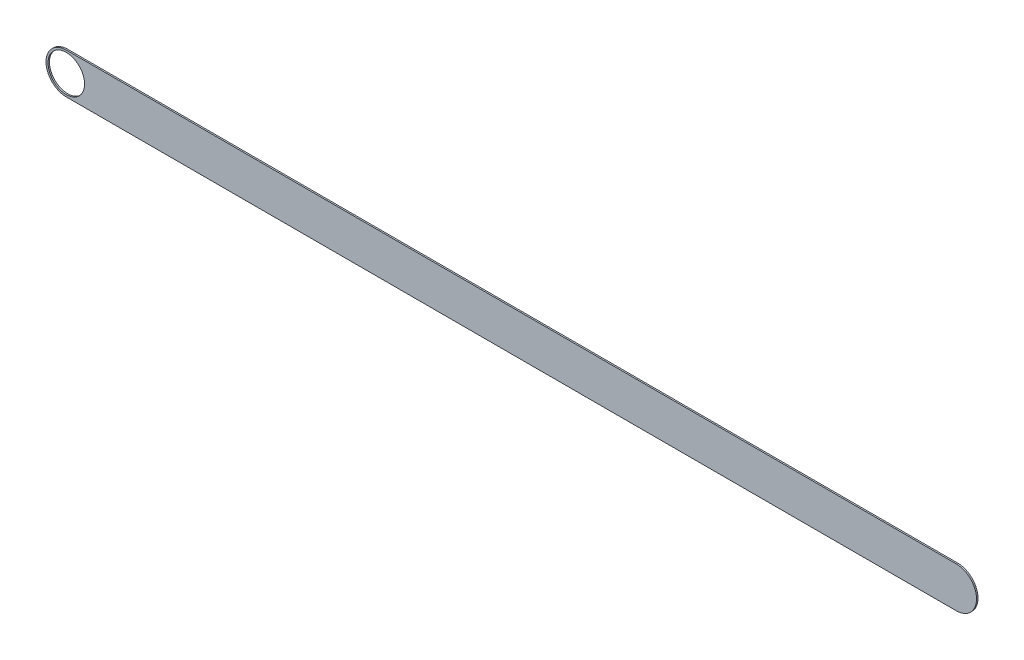
ISO-10303-21;
HEADER;
FILE_DESCRIPTION(('STEP AP214'),'2;1');
FILE_NAME('part.step','',(''),(''),'','','');
FILE_SCHEMA(('AUTOMOTIVE_DESIGN { 1 0 10303 214 1 1 1 1 }'));
ENDSEC;
DATA;
#1=APPLICATION_CONTEXT('core data for automotive mechanical design processes');
#2=APPLICATION_PROTOCOL_DEFINITION('international standard','automotive_design',2000,#1);
#3=PRODUCT_CONTEXT('',#1,'mechanical');
#4=PRODUCT('Part','Part','',(#3));
#5=PRODUCT_RELATED_PRODUCT_CATEGORY('part','',(#4));
#6=PRODUCT_DEFINITION_FORMATION('','',#4);
#7=PRODUCT_DEFINITION_CONTEXT('part definition',#1,'design');
#8=PRODUCT_DEFINITION('design','',#6,#7);
#9=PRODUCT_DEFINITION_SHAPE('','',#8);
#10=(LENGTH_UNIT() NAMED_UNIT(*) SI_UNIT(.MILLI.,.METRE.));
#11=(NAMED_UNIT(*) PLANE_ANGLE_UNIT() SI_UNIT($,.RADIAN.));
#12=(NAMED_UNIT(*) SI_UNIT($,.STERADIAN.) SOLID_ANGLE_UNIT());
#13=UNCERTAINTY_MEASURE_WITH_UNIT(LENGTH_MEASURE(1.E-05),#10,'distance_accuracy_value','');
#14=(GEOMETRIC_REPRESENTATION_CONTEXT(3) GLOBAL_UNCERTAINTY_ASSIGNED_CONTEXT((#13)) GLOBAL_UNIT_ASSIGNED_CONTEXT((#10,
#11,#12)) REPRESENTATION_CONTEXT('',''));
#15=CARTESIAN_POINT('',(0.,0.,0.));
#16=DIRECTION('',(0.,0.,1.));
#17=DIRECTION('',(1.,0.,0.));
#18=AXIS2_PLACEMENT_3D('',#15,#16,#17);
#19=CARTESIAN_POINT('',(49.8999764,47.9999802,0.));
#20=DIRECTION('',(0.,1.,0.));
#21=DIRECTION('',(1.,0.,0.));
#22=AXIS2_PLACEMENT_3D('',#19,#20,#21);
#23=PLANE('',#22);
#24=DIRECTION('',(1.,0.,0.));
#25=VECTOR('',#24,1.);
#26=CARTESIAN_POINT('',(49.8999764,47.9999802,0.03556));
#27=LINE('',#26,#25);
#28=CARTESIAN_POINT('',(49.8999764,47.9999802,0.03556));
#29=VERTEX_POINT('',#28);
#30=CARTESIAN_POINT('',(71.820024,47.9999802,0.03556));
#31=VERTEX_POINT('',#30);
#32=EDGE_CURVE('E11',#29,#31,#27,.T.);
#33=ORIENTED_EDGE('',*,*,#32,.F.);
#34=DIRECTION('',(0.,0.,1.));
#35=VECTOR('',#34,1.);
#36=CARTESIAN_POINT('',(49.8999764,47.9999802,0.));
#37=LINE('',#36,#35);
#38=CARTESIAN_POINT('',(49.8999764,47.9999802,0.));
#39=VERTEX_POINT('',#38);
#40=EDGE_CURVE('E24',#39,#29,#37,.T.);
#41=ORIENTED_EDGE('',*,*,#40,.F.);
#42=DIRECTION('',(1.,0.,0.));
#43=VECTOR('',#42,1.);
#44=CARTESIAN_POINT('',(49.8999764,47.9999802,0.));
#45=LINE('',#44,#43);
#46=CARTESIAN_POINT('',(71.820024,47.9999802,0.));
#47=VERTEX_POINT('',#46);
#48=EDGE_CURVE('E96',#39,#47,#45,.T.);
#49=ORIENTED_EDGE('',*,*,#48,.T.);
#50=DIRECTION('',(0.,0.,1.));
#51=VECTOR('',#50,1.);
#52=CARTESIAN_POINT('',(71.820024,47.9999802,0.));
#53=LINE('',#52,#51);
#54=EDGE_CURVE('E37',#47,#31,#53,.T.);
#55=ORIENTED_EDGE('',*,*,#54,.T.);
#56=EDGE_LOOP('',(#33,#41,#49,#55));
#57=FACE_BOUND('',#56,.T.);
#58=ADVANCED_FACE('F17',(#57),#23,.F.);
#59=CARTESIAN_POINT('',(49.8999764,48.4999792,0.));
#60=DIRECTION('',(0.,0.,-1.));
#61=DIRECTION('',(0.,1.,0.));
#62=AXIS2_PLACEMENT_3D('',#59,#60,#61);
#63=CYLINDRICAL_SURFACE('',#62,0.499999000000002);
#64=CARTESIAN_POINT('',(49.8999764,48.4999792,0.03556));
#65=DIRECTION('',(0.,0.,1.));
#66=DIRECTION('',(0.,1.,0.));
#67=AXIS2_PLACEMENT_3D('',#64,#65,#66);
#68=CIRCLE('',#67,0.499999000000002);
#69=CARTESIAN_POINT('',(49.8999764,48.9999782,0.03556));
#70=VERTEX_POINT('',#69);
#71=EDGE_CURVE('E92',#70,#29,#68,.T.);
#72=ORIENTED_EDGE('',*,*,#71,.F.);
#73=DIRECTION('',(0.,0.,1.));
#74=VECTOR('',#73,1.);
#75=CARTESIAN_POINT('',(49.8999764,48.9999782,0.));
#76=LINE('',#75,#74);
#77=CARTESIAN_POINT('',(49.8999764,48.9999782,0.));
#78=VERTEX_POINT('',#77);
#79=EDGE_CURVE('E90',#78,#70,#76,.T.);
#80=ORIENTED_EDGE('',*,*,#79,.F.);
#81=CARTESIAN_POINT('',(49.8999764,48.4999792,0.));
#82=DIRECTION('',(0.,0.,1.));
#83=DIRECTION('',(0.,1.,0.));
#84=AXIS2_PLACEMENT_3D('',#81,#82,#83);
#85=CIRCLE('',#84,0.499999000000002);
#86=EDGE_CURVE('E88',#78,#39,#85,.T.);
#87=ORIENTED_EDGE('',*,*,#86,.T.);
#88=ORIENTED_EDGE('',*,*,#40,.T.);
#89=EDGE_LOOP('',(#72,#80,#87,#88));
#90=FACE_BOUND('',#89,.T.);
#91=ADVANCED_FACE('F111',(#90),#63,.T.);
#92=CARTESIAN_POINT('',(71.820024,48.4999792,0.));
#93=DIRECTION('',(0.,0.,-1.));
#94=DIRECTION('',(0.,-1.,0.));
#95=AXIS2_PLACEMENT_3D('',#92,#93,#94);
#96=CYLINDRICAL_SURFACE('',#95,0.499999000000002);
#97=CARTESIAN_POINT('',(71.820024,48.4999792,0.03556));
#98=DIRECTION('',(0.,0.,1.));
#99=DIRECTION('',(0.,-1.,0.));
#100=AXIS2_PLACEMENT_3D('',#97,#98,#99);
#101=CIRCLE('',#100,0.499999000000002);
#102=CARTESIAN_POINT('',(71.820024,48.9999782,0.03556));
#103=VERTEX_POINT('',#102);
#104=EDGE_CURVE('E85',#31,#103,#101,.T.);
#105=ORIENTED_EDGE('',*,*,#104,.F.);
#106=ORIENTED_EDGE('',*,*,#54,.F.);
#107=CARTESIAN_POINT('',(71.820024,48.4999792,0.));
#108=DIRECTION('',(0.,0.,1.));
#109=DIRECTION('',(0.,-1.,0.));
#110=AXIS2_PLACEMENT_3D('',#107,#108,#109);
#111=CIRCLE('',#110,0.499999000000002);
#112=CARTESIAN_POINT('',(71.820024,48.9999782,0.));
#113=VERTEX_POINT('',#112);
#114=EDGE_CURVE('E82',#47,#113,#111,.T.);
#115=ORIENTED_EDGE('',*,*,#114,.T.);
#116=DIRECTION('',(0.,0.,1.));
#117=VECTOR('',#116,1.);
#118=CARTESIAN_POINT('',(71.820024,48.9999782,0.));
#119=LINE('',#118,#117);
#120=EDGE_CURVE('E80',#113,#103,#119,.T.);
#121=ORIENTED_EDGE('',*,*,#120,.T.);
#122=EDGE_LOOP('',(#105,#106,#115,#121));
#123=FACE_BOUND('',#122,.T.);
#124=ADVANCED_FACE('F104',(#123),#96,.T.);
#125=CARTESIAN_POINT('',(71.820024,48.9999782,0.));
#126=DIRECTION('',(0.,-1.,0.));
#127=DIRECTION('',(-1.,0.,0.));
#128=AXIS2_PLACEMENT_3D('',#125,#126,#127);
#129=PLANE('',#128);
#130=DIRECTION('',(-1.,0.,0.));
#131=VECTOR('',#130,1.);
#132=CARTESIAN_POINT('',(71.820024,48.9999782,0.03556));
#133=LINE('',#132,#131);
#134=EDGE_CURVE('E77',#103,#70,#133,.T.);
#135=ORIENTED_EDGE('',*,*,#134,.F.);
#136=ORIENTED_EDGE('',*,*,#120,.F.);
#137=DIRECTION('',(-1.,0.,0.));
#138=VECTOR('',#137,1.);
#139=CARTESIAN_POINT('',(71.820024,48.9999782,0.));
#140=LINE('',#139,#138);
#141=EDGE_CURVE('E68',#113,#78,#140,.T.);
#142=ORIENTED_EDGE('',*,*,#141,.T.);
#143=ORIENTED_EDGE('',*,*,#79,.T.);
#144=EDGE_LOOP('',(#135,#136,#142,#143));
#145=FACE_BOUND('',#144,.T.);
#146=ADVANCED_FACE('F110',(#145),#129,.F.);
#147=CARTESIAN_POINT('',(49.8999764,48.4999792,0.));
#148=DIRECTION('',(0.,0.,-1.));
#149=DIRECTION('',(1.,0.,0.));
#150=AXIS2_PLACEMENT_3D('',#147,#148,#149);
#151=CYLINDRICAL_SURFACE('',#150,0.4499991);
#152=DIRECTION('',(0.,0.,1.));
#153=VECTOR('',#152,1.);
#154=CARTESIAN_POINT('',(50.3499755,48.4999792,0.));
#155=LINE('',#154,#153);
#156=CARTESIAN_POINT('',(50.3499755,48.4999792,0.));
#157=VERTEX_POINT('',#156);
#158=CARTESIAN_POINT('',(50.3499755,48.4999792,0.03556));
#159=VERTEX_POINT('',#158);
#160=EDGE_CURVE('E62',#157,#159,#155,.T.);
#161=ORIENTED_EDGE('',*,*,#160,.T.);
#162=CARTESIAN_POINT('',(49.8999764,48.4999792,0.03556));
#163=DIRECTION('',(0.,0.,1.));
#164=DIRECTION('',(1.,0.,0.));
#165=AXIS2_PLACEMENT_3D('',#162,#163,#164);
#166=CIRCLE('',#165,0.4499991);
#167=EDGE_CURVE('E67',#159,#159,#166,.T.);
#168=ORIENTED_EDGE('',*,*,#167,.T.);
#169=ORIENTED_EDGE('',*,*,#160,.F.);
#170=CARTESIAN_POINT('',(49.8999764,48.4999792,0.));
#171=DIRECTION('',(0.,0.,1.));
#172=DIRECTION('',(1.,0.,0.));
#173=AXIS2_PLACEMENT_3D('',#170,#171,#172);
#174=CIRCLE('',#173,0.4499991);
#175=EDGE_CURVE('E65',#157,#157,#174,.T.);
#176=ORIENTED_EDGE('',*,*,#175,.F.);
#177=EDGE_LOOP('',(#161,#168,#169,#176));
#178=FACE_BOUND('',#177,.T.);
#179=ADVANCED_FACE('F64',(#178),#151,.F.);
#180=CARTESIAN_POINT('',(49.8999764,47.9999802,0.));
#181=DIRECTION('',(0.,0.,-1.));
#182=DIRECTION('',(-1.,0.,0.));
#183=AXIS2_PLACEMENT_3D('',#180,#181,#182);
#184=PLANE('',#183);
#185=ORIENTED_EDGE('',*,*,#48,.F.);
#186=ORIENTED_EDGE('',*,*,#86,.F.);
#187=ORIENTED_EDGE('',*,*,#141,.F.);
#188=ORIENTED_EDGE('',*,*,#114,.F.);
#189=EDGE_LOOP('',(#185,#186,#187,#188));
#190=FACE_BOUND('',#189,.T.);
#191=ORIENTED_EDGE('',*,*,#175,.T.);
#192=EDGE_LOOP('',(#191));
#193=FACE_BOUND('',#192,.T.);
#194=ADVANCED_FACE('F71',(#190,#193),#184,.T.);
#195=CARTESIAN_POINT('',(49.8999764,47.9999802,0.03556));
#196=DIRECTION('',(0.,0.,-1.));
#197=DIRECTION('',(-1.,0.,0.));
#198=AXIS2_PLACEMENT_3D('',#195,#196,#197);
#199=PLANE('',#198);
#200=ORIENTED_EDGE('',*,*,#134,.T.);
#201=ORIENTED_EDGE('',*,*,#71,.T.);
#202=ORIENTED_EDGE('',*,*,#32,.T.);
#203=ORIENTED_EDGE('',*,*,#104,.T.);
#204=EDGE_LOOP('',(#200,#201,#202,#203));
#205=FACE_BOUND('',#204,.T.);
#206=ORIENTED_EDGE('',*,*,#167,.F.);
#207=EDGE_LOOP('',(#206));
#208=FACE_BOUND('',#207,.T.);
#209=ADVANCED_FACE('F107',(#205,#208),#199,.F.);
#210=CLOSED_SHELL('',(#58,#91,#124,#146,#179,#194,#209));
#211=MANIFOLD_SOLID_BREP('B1',#210);
#212=ADVANCED_BREP_SHAPE_REPRESENTATION('',(#18,#211),#14);
#213=SHAPE_DEFINITION_REPRESENTATION(#9,#212);
ENDSEC;
END-ISO-10303-21;
